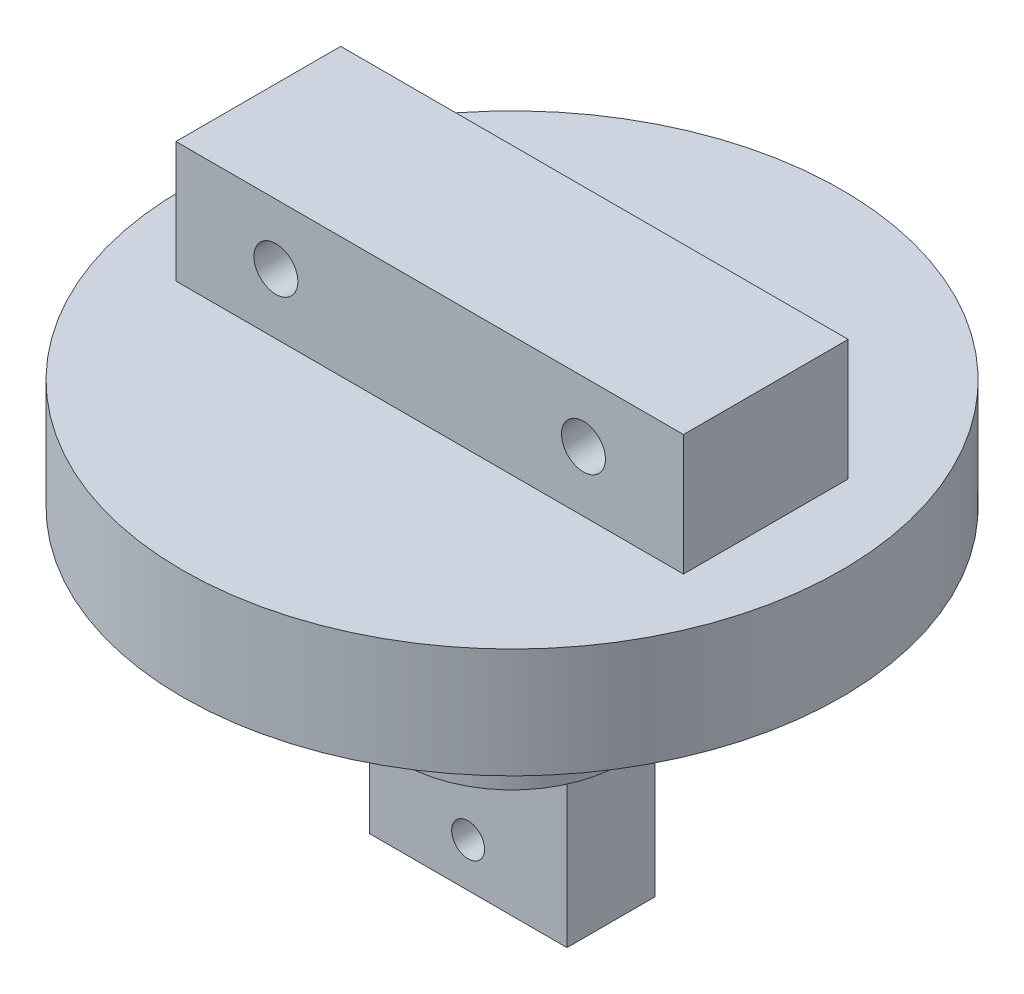
ISO-10303-21;
HEADER;
FILE_DESCRIPTION(('STEP AP214'),'2;1');
FILE_NAME('part.step','',(''),(''),'','','');
FILE_SCHEMA(('AUTOMOTIVE_DESIGN { 1 0 10303 214 1 1 1 1 }'));
ENDSEC;
DATA;
#1=APPLICATION_CONTEXT('core data for automotive mechanical design processes');
#2=APPLICATION_PROTOCOL_DEFINITION('international standard','automotive_design',2000,#1);
#3=PRODUCT_CONTEXT('',#1,'mechanical');
#4=PRODUCT('Part','Part','',(#3));
#5=PRODUCT_RELATED_PRODUCT_CATEGORY('part','',(#4));
#6=PRODUCT_DEFINITION_FORMATION('','',#4);
#7=PRODUCT_DEFINITION_CONTEXT('part definition',#1,'design');
#8=PRODUCT_DEFINITION('design','',#6,#7);
#9=PRODUCT_DEFINITION_SHAPE('','',#8);
#10=(LENGTH_UNIT() NAMED_UNIT(*) SI_UNIT(.MILLI.,.METRE.));
#11=(NAMED_UNIT(*) PLANE_ANGLE_UNIT() SI_UNIT($,.RADIAN.));
#12=(NAMED_UNIT(*) SI_UNIT($,.STERADIAN.) SOLID_ANGLE_UNIT());
#13=UNCERTAINTY_MEASURE_WITH_UNIT(LENGTH_MEASURE(1.E-05),#10,'distance_accuracy_value','');
#14=(GEOMETRIC_REPRESENTATION_CONTEXT(3) GLOBAL_UNCERTAINTY_ASSIGNED_CONTEXT((#13)) GLOBAL_UNIT_ASSIGNED_CONTEXT((#10,
#11,#12)) REPRESENTATION_CONTEXT('',''));
#15=CARTESIAN_POINT('',(0.,0.,0.));
#16=DIRECTION('',(0.,0.,1.));
#17=DIRECTION('',(1.,0.,0.));
#18=AXIS2_PLACEMENT_3D('',#15,#16,#17);
#19=CARTESIAN_POINT('',(0.,10.,0.));
#20=DIRECTION('',(0.,1.,0.));
#21=DIRECTION('',(0.,0.,1.));
#22=AXIS2_PLACEMENT_3D('',#19,#20,#21);
#23=PLANE('',#22);
#24=CARTESIAN_POINT('',(0.,10.,0.));
#25=DIRECTION('',(0.,1.,0.));
#26=DIRECTION('',(0.,0.,1.));
#27=AXIS2_PLACEMENT_3D('',#24,#25,#26);
#28=CIRCLE('',#27,30.);
#29=CARTESIAN_POINT('',(0.,10.,30.));
#30=VERTEX_POINT('',#29);
#31=EDGE_CURVE('E43',#30,#30,#28,.T.);
#32=ORIENTED_EDGE('',*,*,#31,.T.);
#33=EDGE_LOOP('',(#32));
#34=FACE_BOUND('',#33,.T.);
#35=DIRECTION('',(-1.,0.,0.));
#36=VECTOR('',#35,1.);
#37=CARTESIAN_POINT('',(0.,10.,7.5));
#38=LINE('',#37,#36);
#39=CARTESIAN_POINT('',(23.1,10.,7.5));
#40=VERTEX_POINT('',#39);
#41=CARTESIAN_POINT('',(-23.1,10.,7.5));
#42=VERTEX_POINT('',#41);
#43=EDGE_CURVE('E130',#40,#42,#38,.T.);
#44=ORIENTED_EDGE('',*,*,#43,.T.);
#45=DIRECTION('',(0.,0.,-1.));
#46=VECTOR('',#45,1.);
#47=CARTESIAN_POINT('',(-23.1,10.,0.));
#48=LINE('',#47,#46);
#49=CARTESIAN_POINT('',(-23.1,10.,-7.5));
#50=VERTEX_POINT('',#49);
#51=EDGE_CURVE('E51',#42,#50,#48,.T.);
#52=ORIENTED_EDGE('',*,*,#51,.T.);
#53=DIRECTION('',(1.,0.,0.));
#54=VECTOR('',#53,1.);
#55=CARTESIAN_POINT('',(0.,10.,-7.5));
#56=LINE('',#55,#54);
#57=CARTESIAN_POINT('',(23.1,10.,-7.5));
#58=VERTEX_POINT('',#57);
#59=EDGE_CURVE('E119',#50,#58,#56,.T.);
#60=ORIENTED_EDGE('',*,*,#59,.T.);
#61=DIRECTION('',(0.,0.,1.));
#62=VECTOR('',#61,1.);
#63=CARTESIAN_POINT('',(23.1,10.,0.));
#64=LINE('',#63,#62);
#65=EDGE_CURVE('E133',#58,#40,#64,.T.);
#66=ORIENTED_EDGE('',*,*,#65,.T.);
#67=EDGE_LOOP('',(#44,#52,#60,#66));
#68=FACE_BOUND('',#67,.T.);
#69=ADVANCED_FACE('F34',(#34,#68),#23,.T.);
#70=CARTESIAN_POINT('',(0.,-15.25,0.));
#71=DIRECTION('',(0.,-1.,0.));
#72=DIRECTION('',(0.,0.,-1.));
#73=AXIS2_PLACEMENT_3D('',#70,#71,#72);
#74=PLANE('',#73);
#75=CARTESIAN_POINT('',(0.,-15.25,0.));
#76=DIRECTION('',(0.,-1.,0.));
#77=DIRECTION('',(0.,0.,-1.));
#78=AXIS2_PLACEMENT_3D('',#75,#76,#77);
#79=CIRCLE('',#78,10.);
#80=CARTESIAN_POINT('',(0.,-15.25,10.));
#81=VERTEX_POINT('',#80);
#82=EDGE_CURVE('E183',#81,#81,#79,.T.);
#83=ORIENTED_EDGE('',*,*,#82,.T.);
#84=EDGE_LOOP('',(#83));
#85=FACE_BOUND('',#84,.T.);
#86=DIRECTION('',(0.,0.,-1.));
#87=VECTOR('',#86,1.);
#88=CARTESIAN_POINT('',(9.,-15.25,0.));
#89=LINE('',#88,#87);
#90=CARTESIAN_POINT('',(9.,-15.25,4.));
#91=VERTEX_POINT('',#90);
#92=CARTESIAN_POINT('',(9.,-15.25,-4.));
#93=VERTEX_POINT('',#92);
#94=EDGE_CURVE('E168',#91,#93,#89,.T.);
#95=ORIENTED_EDGE('',*,*,#94,.T.);
#96=DIRECTION('',(-1.,0.,0.));
#97=VECTOR('',#96,1.);
#98=CARTESIAN_POINT('',(0.,-15.25,-4.));
#99=LINE('',#98,#97);
#100=CARTESIAN_POINT('',(-9.,-15.25,-4.));
#101=VERTEX_POINT('',#100);
#102=EDGE_CURVE('E59',#93,#101,#99,.T.);
#103=ORIENTED_EDGE('',*,*,#102,.T.);
#104=DIRECTION('',(0.,0.,1.));
#105=VECTOR('',#104,1.);
#106=CARTESIAN_POINT('',(-9.,-15.25,0.));
#107=LINE('',#106,#105);
#108=CARTESIAN_POINT('',(-9.,-15.25,4.));
#109=VERTEX_POINT('',#108);
#110=EDGE_CURVE('E157',#101,#109,#107,.T.);
#111=ORIENTED_EDGE('',*,*,#110,.T.);
#112=DIRECTION('',(1.,0.,0.));
#113=VECTOR('',#112,1.);
#114=CARTESIAN_POINT('',(0.,-15.25,4.));
#115=LINE('',#114,#113);
#116=EDGE_CURVE('E171',#109,#91,#115,.T.);
#117=ORIENTED_EDGE('',*,*,#116,.T.);
#118=EDGE_LOOP('',(#95,#103,#111,#117));
#119=FACE_BOUND('',#118,.T.);
#120=ADVANCED_FACE('F203',(#85,#119),#74,.T.);
#121=CARTESIAN_POINT('',(0.,10.,0.));
#122=DIRECTION('',(0.,-1.,0.));
#123=DIRECTION('',(0.,0.,-1.));
#124=AXIS2_PLACEMENT_3D('',#121,#122,#123);
#125=CYLINDRICAL_SURFACE('',#124,30.);
#126=ORIENTED_EDGE('',*,*,#31,.F.);
#127=EDGE_LOOP('',(#126));
#128=FACE_BOUND('',#127,.T.);
#129=CARTESIAN_POINT('',(0.,0.,0.));
#130=DIRECTION('',(0.,1.,0.));
#131=DIRECTION('',(0.,0.,1.));
#132=AXIS2_PLACEMENT_3D('',#129,#130,#131);
#133=CIRCLE('',#132,30.);
#134=CARTESIAN_POINT('',(0.,0.,30.));
#135=VERTEX_POINT('',#134);
#136=EDGE_CURVE('E38',#135,#135,#133,.T.);
#137=ORIENTED_EDGE('',*,*,#136,.T.);
#138=EDGE_LOOP('',(#137));
#139=FACE_BOUND('',#138,.T.);
#140=ADVANCED_FACE('F36',(#128,#139),#125,.T.);
#141=CARTESIAN_POINT('',(0.,0.,0.));
#142=DIRECTION('',(0.,1.,0.));
#143=DIRECTION('',(0.,0.,1.));
#144=AXIS2_PLACEMENT_3D('',#141,#142,#143);
#145=PLANE('',#144);
#146=CARTESIAN_POINT('',(0.,0.,0.));
#147=DIRECTION('',(0.,-1.,0.));
#148=DIRECTION('',(0.,0.,-1.));
#149=AXIS2_PLACEMENT_3D('',#146,#147,#148);
#150=CIRCLE('',#149,10.);
#151=CARTESIAN_POINT('',(0.,0.,10.));
#152=VERTEX_POINT('',#151);
#153=EDGE_CURVE('E11',#152,#152,#150,.T.);
#154=ORIENTED_EDGE('',*,*,#153,.F.);
#155=EDGE_LOOP('',(#154));
#156=FACE_BOUND('',#155,.T.);
#157=ORIENTED_EDGE('',*,*,#136,.F.);
#158=EDGE_LOOP('',(#157));
#159=FACE_BOUND('',#158,.T.);
#160=ADVANCED_FACE('F192',(#156,#159),#145,.F.);
#161=CARTESIAN_POINT('',(0.,-15.25,0.));
#162=DIRECTION('',(0.,1.,0.));
#163=DIRECTION('',(0.,0.,1.));
#164=AXIS2_PLACEMENT_3D('',#161,#162,#163);
#165=CYLINDRICAL_SURFACE('',#164,10.);
#166=CARTESIAN_POINT('',(0.,-15.25,10.));
#167=CARTESIAN_POINT('',(0.,-15.0911458333333,10.));
#168=CARTESIAN_POINT('',(0.,-14.9322916666667,10.));
#169=CARTESIAN_POINT('',(0.,-14.6145833333333,10.));
#170=CARTESIAN_POINT('',(0.,-14.4557291666667,10.));
#171=CARTESIAN_POINT('',(0.,-14.1380208333333,10.));
#172=CARTESIAN_POINT('',(0.,-13.9791666666667,10.));
#173=CARTESIAN_POINT('',(0.,-13.6614583333333,10.));
#174=CARTESIAN_POINT('',(0.,-13.5026041666667,10.));
#175=CARTESIAN_POINT('',(0.,-13.1848958333333,10.));
#176=CARTESIAN_POINT('',(0.,-13.0260416666667,10.));
#177=CARTESIAN_POINT('',(0.,-12.7083333333333,10.));
#178=CARTESIAN_POINT('',(0.,-12.5494791666667,10.));
#179=CARTESIAN_POINT('',(0.,-12.2317708333333,10.));
#180=CARTESIAN_POINT('',(0.,-12.0729166666667,10.));
#181=CARTESIAN_POINT('',(0.,-11.7552083333333,10.));
#182=CARTESIAN_POINT('',(0.,-11.5963541666667,10.));
#183=CARTESIAN_POINT('',(0.,-11.2786458333333,10.));
#184=CARTESIAN_POINT('',(0.,-11.1197916666667,10.));
#185=CARTESIAN_POINT('',(0.,-10.8020833333333,10.));
#186=CARTESIAN_POINT('',(0.,-10.6432291666667,10.));
#187=CARTESIAN_POINT('',(0.,-10.3255208333333,10.));
#188=CARTESIAN_POINT('',(0.,-10.1666666666667,10.));
#189=CARTESIAN_POINT('',(0.,-9.84895833333333,10.));
#190=CARTESIAN_POINT('',(0.,-9.69010416666666,10.));
#191=CARTESIAN_POINT('',(0.,-9.37239583333333,10.));
#192=CARTESIAN_POINT('',(0.,-9.21354166666666,10.));
#193=CARTESIAN_POINT('',(0.,-8.89583333333333,10.));
#194=CARTESIAN_POINT('',(0.,-8.73697916666667,10.));
#195=CARTESIAN_POINT('',(0.,-8.41927083333333,10.));
#196=CARTESIAN_POINT('',(0.,-8.26041666666667,10.));
#197=CARTESIAN_POINT('',(0.,-7.94270833333333,10.));
#198=CARTESIAN_POINT('',(0.,-7.78385416666667,10.));
#199=CARTESIAN_POINT('',(0.,-7.46614583333333,10.));
#200=CARTESIAN_POINT('',(0.,-7.30729166666667,10.));
#201=CARTESIAN_POINT('',(0.,-6.98958333333333,10.));
#202=CARTESIAN_POINT('',(0.,-6.83072916666667,10.));
#203=CARTESIAN_POINT('',(0.,-6.51302083333333,10.));
#204=CARTESIAN_POINT('',(0.,-6.35416666666667,10.));
#205=CARTESIAN_POINT('',(0.,-6.03645833333333,10.));
#206=CARTESIAN_POINT('',(0.,-5.87760416666667,10.));
#207=CARTESIAN_POINT('',(0.,-5.55989583333333,10.));
#208=CARTESIAN_POINT('',(0.,-5.40104166666667,10.));
#209=CARTESIAN_POINT('',(0.,-5.08333333333333,10.));
#210=CARTESIAN_POINT('',(0.,-4.92447916666667,10.));
#211=CARTESIAN_POINT('',(0.,-4.60677083333333,10.));
#212=CARTESIAN_POINT('',(0.,-4.44791666666667,10.));
#213=CARTESIAN_POINT('',(0.,-4.13020833333333,10.));
#214=CARTESIAN_POINT('',(0.,-3.97135416666667,10.));
#215=CARTESIAN_POINT('',(0.,-3.65364583333333,10.));
#216=CARTESIAN_POINT('',(0.,-3.49479166666667,10.));
#217=CARTESIAN_POINT('',(0.,-3.17708333333333,10.));
#218=CARTESIAN_POINT('',(0.,-3.01822916666667,10.));
#219=CARTESIAN_POINT('',(0.,-2.70052083333333,10.));
#220=CARTESIAN_POINT('',(0.,-2.54166666666667,10.));
#221=CARTESIAN_POINT('',(0.,-2.22395833333333,10.));
#222=CARTESIAN_POINT('',(0.,-2.06510416666667,10.));
#223=CARTESIAN_POINT('',(0.,-1.74739583333333,10.));
#224=CARTESIAN_POINT('',(0.,-1.58854166666667,10.));
#225=CARTESIAN_POINT('',(0.,-1.27083333333333,10.));
#226=CARTESIAN_POINT('',(0.,-1.11197916666667,10.));
#227=CARTESIAN_POINT('',(0.,-0.794270833333332,10.));
#228=CARTESIAN_POINT('',(0.,-0.635416666666665,10.));
#229=CARTESIAN_POINT('',(0.,-0.317708333333331,10.));
#230=CARTESIAN_POINT('',(0.,-0.158854166666665,10.));
#231=CARTESIAN_POINT('',(0.,0.,10.));
#232=B_SPLINE_CURVE_WITH_KNOTS('',3,(#166,#167,#168,#169,#170,#171,#172,#173,#174,#175,#176,
#177,#178,#179,#180,#181,#182,#183,#184,#185,#186,#187,#188,#189,#190,#191,#192,#193,#194,#195,
#196,#197,#198,#199,#200,#201,#202,#203,#204,#205,#206,#207,#208,#209,#210,#211,#212,#213,#214,
#215,#216,#217,#218,#219,#220,#221,#222,#223,#224,#225,#226,#227,#228,#229,#230,#231),
.UNSPECIFIED.,.F.,.F.,(4,2,2,2,2,2,2,2,2,2,2,2,2,2,2,2,2,2,2,2,2,2,2,2,2,2,2,2,2,2,2,2,4),(0.,
0.476562500000001,0.953125000000001,1.4296875,1.90625,2.3828125,2.859375,3.3359375,3.8125,
4.2890625,4.765625,5.2421875,5.71875,6.1953125,6.671875,7.1484375,7.625,8.1015625,8.578125,
9.0546875,9.53125,10.0078125,10.484375,10.9609375,11.4375,11.9140625,12.390625,12.8671875,
13.34375,13.8203125,14.296875,14.7734375,15.25),.UNSPECIFIED.);
#233=EDGE_CURVE('BSEAM194',#81,#152,#232,.T.);
#234=ORIENTED_EDGE('',*,*,#82,.F.);
#235=ORIENTED_EDGE('',*,*,#153,.T.);
#236=ORIENTED_EDGE('',*,*,#233,.T.);
#237=ORIENTED_EDGE('',*,*,#233,.F.);
#238=EDGE_LOOP('',(#234,#236,#235,#237));
#239=FACE_BOUND('',#238,.T.);
#240=ADVANCED_FACE('F194',(#239),#165,.T.);
#241=CARTESIAN_POINT('',(0.,-28.25,-4.));
#242=DIRECTION('',(0.,0.,-1.));
#243=DIRECTION('',(-1.,0.,0.));
#244=AXIS2_PLACEMENT_3D('',#241,#242,#243);
#245=PLANE('',#244);
#246=CARTESIAN_POINT('',(0.,-24.25,-4.));
#247=DIRECTION('',(0.,0.,-1.));
#248=DIRECTION('',(-1.,0.,0.));
#249=AXIS2_PLACEMENT_3D('',#246,#247,#248);
#250=CIRCLE('',#249,1.49999999999999);
#251=CARTESIAN_POINT('',(-1.49999999999999,-24.25,-4.));
#252=VERTEX_POINT('',#251);
#253=EDGE_CURVE('E144',#252,#252,#250,.T.);
#254=ORIENTED_EDGE('',*,*,#253,.F.);
#255=EDGE_LOOP('',(#254));
#256=FACE_BOUND('',#255,.T.);
#257=CARTESIAN_POINT('',(0.,-18.25,-4.));
#258=DIRECTION('',(0.,0.,-1.));
#259=DIRECTION('',(-1.,0.,0.));
#260=AXIS2_PLACEMENT_3D('',#257,#258,#259);
#261=CIRCLE('',#260,1.49999999999999);
#262=CARTESIAN_POINT('',(-1.49999999999999,-18.25,-4.));
#263=VERTEX_POINT('',#262);
#264=EDGE_CURVE('E150',#263,#263,#261,.T.);
#265=ORIENTED_EDGE('',*,*,#264,.F.);
#266=EDGE_LOOP('',(#265));
#267=FACE_BOUND('',#266,.T.);
#268=ORIENTED_EDGE('',*,*,#102,.F.);
#269=DIRECTION('',(0.,1.,0.));
#270=VECTOR('',#269,1.);
#271=CARTESIAN_POINT('',(9.,-28.25,-4.));
#272=LINE('',#271,#270);
#273=CARTESIAN_POINT('',(9.,-28.25,-4.));
#274=VERTEX_POINT('',#273);
#275=EDGE_CURVE('E181',#274,#93,#272,.T.);
#276=ORIENTED_EDGE('',*,*,#275,.F.);
#277=DIRECTION('',(-1.,0.,0.));
#278=VECTOR('',#277,1.);
#279=CARTESIAN_POINT('',(0.,-28.25,-4.));
#280=LINE('',#279,#278);
#281=CARTESIAN_POINT('',(-9.,-28.25,-4.));
#282=VERTEX_POINT('',#281);
#283=EDGE_CURVE('E153',#274,#282,#280,.T.);
#284=ORIENTED_EDGE('',*,*,#283,.T.);
#285=DIRECTION('',(0.,1.,0.));
#286=VECTOR('',#285,1.);
#287=CARTESIAN_POINT('',(-9.,-28.25,-4.));
#288=LINE('',#287,#286);
#289=EDGE_CURVE('E166',#282,#101,#288,.T.);
#290=ORIENTED_EDGE('',*,*,#289,.T.);
#291=EDGE_LOOP('',(#268,#276,#284,#290));
#292=FACE_BOUND('',#291,.T.);
#293=ADVANCED_FACE('F200',(#256,#267,#292),#245,.T.);
#294=CARTESIAN_POINT('',(9.,-28.25,0.));
#295=DIRECTION('',(1.,0.,0.));
#296=DIRECTION('',(0.,0.,-1.));
#297=AXIS2_PLACEMENT_3D('',#294,#295,#296);
#298=PLANE('',#297);
#299=ORIENTED_EDGE('',*,*,#94,.F.);
#300=DIRECTION('',(0.,1.,0.));
#301=VECTOR('',#300,1.);
#302=CARTESIAN_POINT('',(9.,-28.25,4.));
#303=LINE('',#302,#301);
#304=CARTESIAN_POINT('',(9.,-28.25,4.));
#305=VERTEX_POINT('',#304);
#306=EDGE_CURVE('E179',#305,#91,#303,.T.);
#307=ORIENTED_EDGE('',*,*,#306,.F.);
#308=DIRECTION('',(0.,0.,-1.));
#309=VECTOR('',#308,1.);
#310=CARTESIAN_POINT('',(9.,-28.25,0.));
#311=LINE('',#310,#309);
#312=EDGE_CURVE('E156',#305,#274,#311,.T.);
#313=ORIENTED_EDGE('',*,*,#312,.T.);
#314=ORIENTED_EDGE('',*,*,#275,.T.);
#315=EDGE_LOOP('',(#299,#307,#313,#314));
#316=FACE_BOUND('',#315,.T.);
#317=ADVANCED_FACE('F217',(#316),#298,.T.);
#318=CARTESIAN_POINT('',(0.,-28.25,4.));
#319=DIRECTION('',(0.,0.,1.));
#320=DIRECTION('',(1.,0.,0.));
#321=AXIS2_PLACEMENT_3D('',#318,#319,#320);
#322=PLANE('',#321);
#323=CARTESIAN_POINT('',(0.,-24.25,4.));
#324=DIRECTION('',(0.,0.,1.));
#325=DIRECTION('',(1.,0.,0.));
#326=AXIS2_PLACEMENT_3D('',#323,#324,#325);
#327=CIRCLE('',#326,1.49999999999999);
#328=CARTESIAN_POINT('',(1.49999999999999,-24.25,4.));
#329=VERTEX_POINT('',#328);
#330=EDGE_CURVE('E108',#329,#329,#327,.T.);
#331=ORIENTED_EDGE('',*,*,#330,.F.);
#332=EDGE_LOOP('',(#331));
#333=FACE_BOUND('',#332,.T.);
#334=CARTESIAN_POINT('',(0.,-18.25,4.));
#335=DIRECTION('',(0.,0.,1.));
#336=DIRECTION('',(1.,0.,0.));
#337=AXIS2_PLACEMENT_3D('',#334,#335,#336);
#338=CIRCLE('',#337,1.49999999999999);
#339=CARTESIAN_POINT('',(1.49999999999999,-18.25,4.));
#340=VERTEX_POINT('',#339);
#341=EDGE_CURVE('E147',#340,#340,#338,.T.);
#342=ORIENTED_EDGE('',*,*,#341,.F.);
#343=EDGE_LOOP('',(#342));
#344=FACE_BOUND('',#343,.T.);
#345=ORIENTED_EDGE('',*,*,#116,.F.);
#346=DIRECTION('',(0.,1.,0.));
#347=VECTOR('',#346,1.);
#348=CARTESIAN_POINT('',(-9.,-28.25,4.));
#349=LINE('',#348,#347);
#350=CARTESIAN_POINT('',(-9.,-28.25,4.));
#351=VERTEX_POINT('',#350);
#352=EDGE_CURVE('E177',#351,#109,#349,.T.);
#353=ORIENTED_EDGE('',*,*,#352,.F.);
#354=DIRECTION('',(1.,0.,0.));
#355=VECTOR('',#354,1.);
#356=CARTESIAN_POINT('',(0.,-28.25,4.));
#357=LINE('',#356,#355);
#358=EDGE_CURVE('E160',#351,#305,#357,.T.);
#359=ORIENTED_EDGE('',*,*,#358,.T.);
#360=ORIENTED_EDGE('',*,*,#306,.T.);
#361=EDGE_LOOP('',(#345,#353,#359,#360));
#362=FACE_BOUND('',#361,.T.);
#363=ADVANCED_FACE('F221',(#333,#344,#362),#322,.T.);
#364=CARTESIAN_POINT('',(-9.,-28.25,0.));
#365=DIRECTION('',(-1.,0.,0.));
#366=DIRECTION('',(0.,0.,1.));
#367=AXIS2_PLACEMENT_3D('',#364,#365,#366);
#368=PLANE('',#367);
#369=ORIENTED_EDGE('',*,*,#110,.F.);
#370=ORIENTED_EDGE('',*,*,#289,.F.);
#371=DIRECTION('',(0.,0.,1.));
#372=VECTOR('',#371,1.);
#373=CARTESIAN_POINT('',(-9.,-28.25,0.));
#374=LINE('',#373,#372);
#375=EDGE_CURVE('E163',#282,#351,#374,.T.);
#376=ORIENTED_EDGE('',*,*,#375,.T.);
#377=ORIENTED_EDGE('',*,*,#352,.T.);
#378=EDGE_LOOP('',(#369,#370,#376,#377));
#379=FACE_BOUND('',#378,.T.);
#380=ADVANCED_FACE('F225',(#379),#368,.T.);
#381=CARTESIAN_POINT('',(0.,-28.25,0.));
#382=DIRECTION('',(0.,-1.,0.));
#383=DIRECTION('',(0.,0.,-1.));
#384=AXIS2_PLACEMENT_3D('',#381,#382,#383);
#385=PLANE('',#384);
#386=ORIENTED_EDGE('',*,*,#283,.F.);
#387=ORIENTED_EDGE('',*,*,#312,.F.);
#388=ORIENTED_EDGE('',*,*,#358,.F.);
#389=ORIENTED_EDGE('',*,*,#375,.F.);
#390=EDGE_LOOP('',(#386,#387,#388,#389));
#391=FACE_BOUND('',#390,.T.);
#392=ADVANCED_FACE('F229',(#391),#385,.T.);
#393=CARTESIAN_POINT('',(0.,-18.25,4.));
#394=DIRECTION('',(0.,0.,1.));
#395=DIRECTION('',(1.,0.,0.));
#396=AXIS2_PLACEMENT_3D('',#393,#394,#395);
#397=CYLINDRICAL_SURFACE('',#396,1.49999999999999);
#398=ORIENTED_EDGE('',*,*,#264,.T.);
#399=EDGE_LOOP('',(#398));
#400=FACE_BOUND('',#399,.T.);
#401=ORIENTED_EDGE('',*,*,#341,.T.);
#402=EDGE_LOOP('',(#401));
#403=FACE_BOUND('',#402,.T.);
#404=ADVANCED_FACE('F233',(#400,#403),#397,.F.);
#405=CARTESIAN_POINT('',(0.,-24.25,4.));
#406=DIRECTION('',(0.,0.,1.));
#407=DIRECTION('',(1.,0.,0.));
#408=AXIS2_PLACEMENT_3D('',#405,#406,#407);
#409=CYLINDRICAL_SURFACE('',#408,1.49999999999999);
#410=ORIENTED_EDGE('',*,*,#253,.T.);
#411=EDGE_LOOP('',(#410));
#412=FACE_BOUND('',#411,.T.);
#413=ORIENTED_EDGE('',*,*,#330,.T.);
#414=EDGE_LOOP('',(#413));
#415=FACE_BOUND('',#414,.T.);
#416=ADVANCED_FACE('F237',(#412,#415),#409,.F.);
#417=CARTESIAN_POINT('',(-23.1,21.,0.));
#418=DIRECTION('',(-1.,0.,0.));
#419=DIRECTION('',(0.,0.,1.));
#420=AXIS2_PLACEMENT_3D('',#417,#418,#419);
#421=PLANE('',#420);
#422=ORIENTED_EDGE('',*,*,#51,.F.);
#423=DIRECTION('',(0.,-1.,0.));
#424=VECTOR('',#423,1.);
#425=CARTESIAN_POINT('',(-23.1,21.,7.5));
#426=LINE('',#425,#424);
#427=CARTESIAN_POINT('',(-23.1,21.,7.5));
#428=VERTEX_POINT('',#427);
#429=EDGE_CURVE('E99',#428,#42,#426,.T.);
#430=ORIENTED_EDGE('',*,*,#429,.F.);
#431=DIRECTION('',(0.,0.,-1.));
#432=VECTOR('',#431,1.);
#433=CARTESIAN_POINT('',(-23.1,21.,0.));
#434=LINE('',#433,#432);
#435=CARTESIAN_POINT('',(-23.1,21.,-7.5));
#436=VERTEX_POINT('',#435);
#437=EDGE_CURVE('E102',#428,#436,#434,.T.);
#438=ORIENTED_EDGE('',*,*,#437,.T.);
#439=DIRECTION('',(0.,-1.,0.));
#440=VECTOR('',#439,1.);
#441=CARTESIAN_POINT('',(-23.1,21.,-7.5));
#442=LINE('',#441,#440);
#443=EDGE_CURVE('E128',#436,#50,#442,.T.);
#444=ORIENTED_EDGE('',*,*,#443,.T.);
#445=EDGE_LOOP('',(#422,#430,#438,#444));
#446=FACE_BOUND('',#445,.T.);
#447=ADVANCED_FACE('F101',(#446),#421,.T.);
#448=CARTESIAN_POINT('',(0.,21.,7.5));
#449=DIRECTION('',(0.,0.,1.));
#450=DIRECTION('',(1.,0.,0.));
#451=AXIS2_PLACEMENT_3D('',#448,#449,#450);
#452=PLANE('',#451);
#453=CARTESIAN_POINT('',(-14.,15.5,7.5));
#454=DIRECTION('',(0.,0.,1.));
#455=DIRECTION('',(1.,0.,0.));
#456=AXIS2_PLACEMENT_3D('',#453,#454,#455);
#457=CIRCLE('',#456,2.);
#458=CARTESIAN_POINT('',(-12.,15.5,7.5));
#459=VERTEX_POINT('',#458);
#460=EDGE_CURVE('E272',#459,#459,#457,.T.);
#461=ORIENTED_EDGE('',*,*,#460,.F.);
#462=EDGE_LOOP('',(#461));
#463=FACE_BOUND('',#462,.T.);
#464=CARTESIAN_POINT('',(14.,15.5,7.5));
#465=DIRECTION('',(0.,0.,1.));
#466=DIRECTION('',(1.,0.,0.));
#467=AXIS2_PLACEMENT_3D('',#464,#465,#466);
#468=CIRCLE('',#467,2.);
#469=CARTESIAN_POINT('',(16.,15.5,7.5));
#470=VERTEX_POINT('',#469);
#471=EDGE_CURVE('E131',#470,#470,#468,.T.);
#472=ORIENTED_EDGE('',*,*,#471,.F.);
#473=EDGE_LOOP('',(#472));
#474=FACE_BOUND('',#473,.T.);
#475=ORIENTED_EDGE('',*,*,#43,.F.);
#476=DIRECTION('',(0.,-1.,0.));
#477=VECTOR('',#476,1.);
#478=CARTESIAN_POINT('',(23.1,21.,7.5));
#479=LINE('',#478,#477);
#480=CARTESIAN_POINT('',(23.1,21.,7.5));
#481=VERTEX_POINT('',#480);
#482=EDGE_CURVE('E109',#481,#40,#479,.T.);
#483=ORIENTED_EDGE('',*,*,#482,.F.);
#484=DIRECTION('',(-1.,0.,0.));
#485=VECTOR('',#484,1.);
#486=CARTESIAN_POINT('',(0.,21.,7.5));
#487=LINE('',#486,#485);
#488=EDGE_CURVE('E115',#481,#428,#487,.T.);
#489=ORIENTED_EDGE('',*,*,#488,.T.);
#490=ORIENTED_EDGE('',*,*,#429,.T.);
#491=EDGE_LOOP('',(#475,#483,#489,#490));
#492=FACE_BOUND('',#491,.T.);
#493=ADVANCED_FACE('F121',(#463,#474,#492),#452,.T.);
#494=CARTESIAN_POINT('',(23.1,21.,0.));
#495=DIRECTION('',(1.,0.,0.));
#496=DIRECTION('',(0.,0.,-1.));
#497=AXIS2_PLACEMENT_3D('',#494,#495,#496);
#498=PLANE('',#497);
#499=ORIENTED_EDGE('',*,*,#65,.F.);
#500=DIRECTION('',(0.,-1.,0.));
#501=VECTOR('',#500,1.);
#502=CARTESIAN_POINT('',(23.1,21.,-7.5));
#503=LINE('',#502,#501);
#504=CARTESIAN_POINT('',(23.1,21.,-7.5));
#505=VERTEX_POINT('',#504);
#506=EDGE_CURVE('E139',#505,#58,#503,.T.);
#507=ORIENTED_EDGE('',*,*,#506,.F.);
#508=DIRECTION('',(0.,0.,1.));
#509=VECTOR('',#508,1.);
#510=CARTESIAN_POINT('',(23.1,21.,0.));
#511=LINE('',#510,#509);
#512=EDGE_CURVE('E122',#505,#481,#511,.T.);
#513=ORIENTED_EDGE('',*,*,#512,.T.);
#514=ORIENTED_EDGE('',*,*,#482,.T.);
#515=EDGE_LOOP('',(#499,#507,#513,#514));
#516=FACE_BOUND('',#515,.T.);
#517=ADVANCED_FACE('F246',(#516),#498,.T.);
#518=CARTESIAN_POINT('',(0.,21.,-7.5));
#519=DIRECTION('',(0.,0.,-1.));
#520=DIRECTION('',(-1.,0.,0.));
#521=AXIS2_PLACEMENT_3D('',#518,#519,#520);
#522=PLANE('',#521);
#523=CARTESIAN_POINT('',(-14.,15.5,-7.5));
#524=DIRECTION('',(0.,0.,-1.));
#525=DIRECTION('',(-1.,0.,0.));
#526=AXIS2_PLACEMENT_3D('',#523,#524,#525);
#527=CIRCLE('',#526,2.);
#528=CARTESIAN_POINT('',(-16.,15.5,-7.5));
#529=VERTEX_POINT('',#528);
#530=EDGE_CURVE('E269',#529,#529,#527,.T.);
#531=ORIENTED_EDGE('',*,*,#530,.F.);
#532=EDGE_LOOP('',(#531));
#533=FACE_BOUND('',#532,.T.);
#534=CARTESIAN_POINT('',(14.,15.5,-7.5));
#535=DIRECTION('',(0.,0.,-1.));
#536=DIRECTION('',(-1.,0.,0.));
#537=AXIS2_PLACEMENT_3D('',#534,#535,#536);
#538=CIRCLE('',#537,2.);
#539=CARTESIAN_POINT('',(12.,15.5,-7.5));
#540=VERTEX_POINT('',#539);
#541=EDGE_CURVE('E273',#540,#540,#538,.T.);
#542=ORIENTED_EDGE('',*,*,#541,.F.);
#543=EDGE_LOOP('',(#542));
#544=FACE_BOUND('',#543,.T.);
#545=ORIENTED_EDGE('',*,*,#59,.F.);
#546=ORIENTED_EDGE('',*,*,#443,.F.);
#547=DIRECTION('',(1.,0.,0.));
#548=VECTOR('',#547,1.);
#549=CARTESIAN_POINT('',(0.,21.,-7.5));
#550=LINE('',#549,#548);
#551=EDGE_CURVE('E118',#436,#505,#550,.T.);
#552=ORIENTED_EDGE('',*,*,#551,.T.);
#553=ORIENTED_EDGE('',*,*,#506,.T.);
#554=EDGE_LOOP('',(#545,#546,#552,#553));
#555=FACE_BOUND('',#554,.T.);
#556=ADVANCED_FACE('F250',(#533,#544,#555),#522,.T.);
#557=CARTESIAN_POINT('',(0.,21.,0.));
#558=DIRECTION('',(0.,1.,0.));
#559=DIRECTION('',(0.,0.,1.));
#560=AXIS2_PLACEMENT_3D('',#557,#558,#559);
#561=PLANE('',#560);
#562=ORIENTED_EDGE('',*,*,#437,.F.);
#563=ORIENTED_EDGE('',*,*,#488,.F.);
#564=ORIENTED_EDGE('',*,*,#512,.F.);
#565=ORIENTED_EDGE('',*,*,#551,.F.);
#566=EDGE_LOOP('',(#562,#563,#564,#565));
#567=FACE_BOUND('',#566,.T.);
#568=ADVANCED_FACE('F113',(#567),#561,.T.);
#569=CARTESIAN_POINT('',(14.,15.5,-7.5));
#570=DIRECTION('',(0.,0.,-1.));
#571=DIRECTION('',(-1.,0.,0.));
#572=AXIS2_PLACEMENT_3D('',#569,#570,#571);
#573=CYLINDRICAL_SURFACE('',#572,2.);
#574=ORIENTED_EDGE('',*,*,#541,.T.);
#575=EDGE_LOOP('',(#574));
#576=FACE_BOUND('',#575,.T.);
#577=ORIENTED_EDGE('',*,*,#471,.T.);
#578=EDGE_LOOP('',(#577));
#579=FACE_BOUND('',#578,.T.);
#580=ADVANCED_FACE('F257',(#576,#579),#573,.F.);
#581=CARTESIAN_POINT('',(-14.,15.5,-7.5));
#582=DIRECTION('',(0.,0.,-1.));
#583=DIRECTION('',(-1.,0.,0.));
#584=AXIS2_PLACEMENT_3D('',#581,#582,#583);
#585=CYLINDRICAL_SURFACE('',#584,2.);
#586=ORIENTED_EDGE('',*,*,#530,.T.);
#587=EDGE_LOOP('',(#586));
#588=FACE_BOUND('',#587,.T.);
#589=ORIENTED_EDGE('',*,*,#460,.T.);
#590=EDGE_LOOP('',(#589));
#591=FACE_BOUND('',#590,.T.);
#592=ADVANCED_FACE('F260',(#588,#591),#585,.F.);
#593=CLOSED_SHELL('',(#69,#120,#140,#160,#240,#293,#317,#363,#380,#392,#404,#416,#447,#493,#517,
#556,#568,#580,#592));
#594=MANIFOLD_SOLID_BREP('B2',#593);
#595=ADVANCED_BREP_SHAPE_REPRESENTATION('',(#18,#594),#14);
#596=SHAPE_DEFINITION_REPRESENTATION(#9,#595);
ENDSEC;
END-ISO-10303-21;
